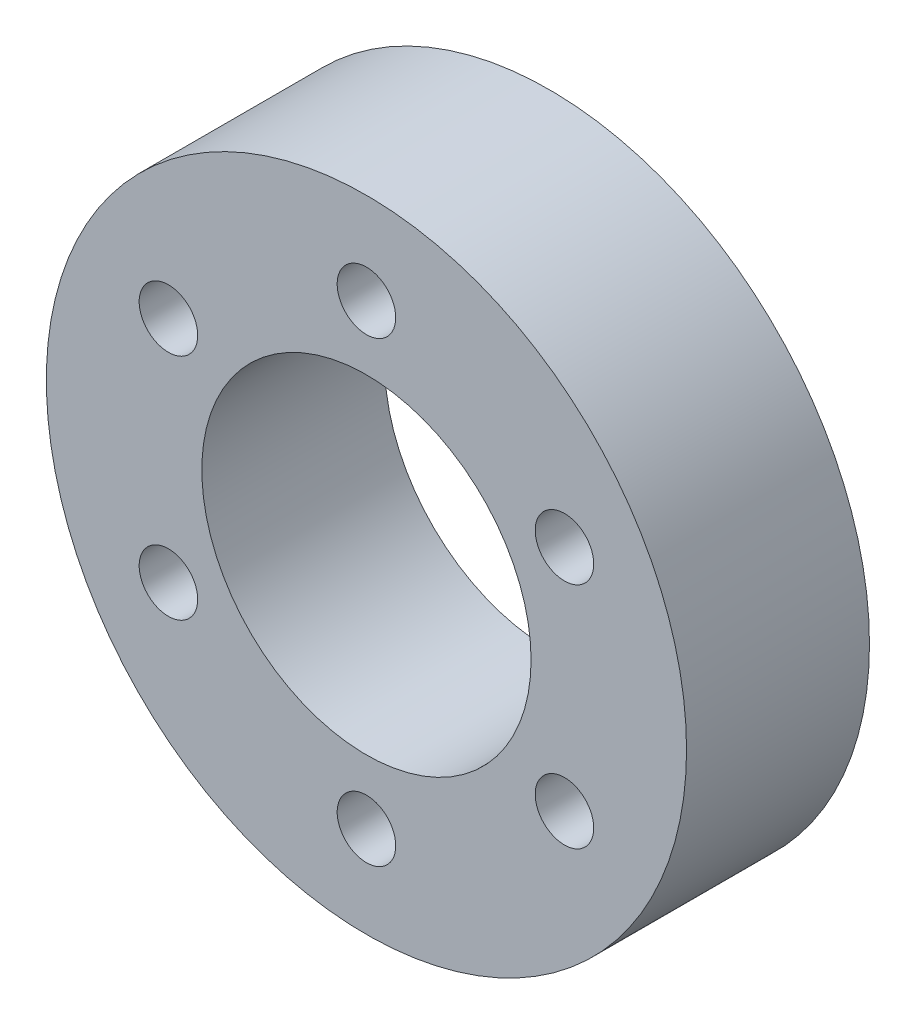
ISO-10303-21;
HEADER;
FILE_DESCRIPTION(('STEP AP214'),'2;1');
FILE_NAME('part.step','',(''),(''),'','','');
FILE_SCHEMA(('AUTOMOTIVE_DESIGN { 1 0 10303 214 1 1 1 1 }'));
ENDSEC;
DATA;
#1=APPLICATION_CONTEXT('core data for automotive mechanical design processes');
#2=APPLICATION_PROTOCOL_DEFINITION('international standard','automotive_design',2000,#1);
#3=PRODUCT_CONTEXT('',#1,'mechanical');
#4=PRODUCT('Part','Part','',(#3));
#5=PRODUCT_RELATED_PRODUCT_CATEGORY('part','',(#4));
#6=PRODUCT_DEFINITION_FORMATION('','',#4);
#7=PRODUCT_DEFINITION_CONTEXT('part definition',#1,'design');
#8=PRODUCT_DEFINITION('design','',#6,#7);
#9=PRODUCT_DEFINITION_SHAPE('','',#8);
#10=(LENGTH_UNIT() NAMED_UNIT(*) SI_UNIT(.MILLI.,.METRE.));
#11=(NAMED_UNIT(*) PLANE_ANGLE_UNIT() SI_UNIT($,.RADIAN.));
#12=(NAMED_UNIT(*) SI_UNIT($,.STERADIAN.) SOLID_ANGLE_UNIT());
#13=UNCERTAINTY_MEASURE_WITH_UNIT(LENGTH_MEASURE(1.E-05),#10,'distance_accuracy_value','');
#14=(GEOMETRIC_REPRESENTATION_CONTEXT(3) GLOBAL_UNCERTAINTY_ASSIGNED_CONTEXT((#13)) GLOBAL_UNIT_ASSIGNED_CONTEXT((#10,
#11,#12)) REPRESENTATION_CONTEXT('',''));
#15=CARTESIAN_POINT('',(0.,0.,0.));
#16=DIRECTION('',(0.,0.,1.));
#17=DIRECTION('',(1.,0.,0.));
#18=AXIS2_PLACEMENT_3D('',#15,#16,#17);
#19=CARTESIAN_POINT('',(0.,0.,10.));
#20=DIRECTION('',(0.,0.,1.));
#21=DIRECTION('',(1.,0.,0.));
#22=AXIS2_PLACEMENT_3D('',#19,#20,#21);
#23=PLANE('',#22);
#24=CARTESIAN_POINT('',(-10.8253175473055,6.24999999999999,10.));
#25=DIRECTION('',(0.,0.,1.));
#26=DIRECTION('',(1.,0.,0.));
#27=AXIS2_PLACEMENT_3D('',#24,#25,#26);
#28=CIRCLE('',#27,1.6);
#29=CARTESIAN_POINT('',(-9.22531754730549,6.24999999999999,10.));
#30=VERTEX_POINT('',#29);
#31=EDGE_CURVE('E71',#30,#30,#28,.T.);
#32=ORIENTED_EDGE('',*,*,#31,.F.);
#33=EDGE_LOOP('',(#32));
#34=FACE_BOUND('',#33,.T.);
#35=CARTESIAN_POINT('',(0.,-12.5,10.));
#36=DIRECTION('',(0.,0.,1.));
#37=DIRECTION('',(1.,0.,0.));
#38=AXIS2_PLACEMENT_3D('',#35,#36,#37);
#39=CIRCLE('',#38,1.6);
#40=CARTESIAN_POINT('',(1.6,-12.5,10.));
#41=VERTEX_POINT('',#40);
#42=EDGE_CURVE('E59',#41,#41,#39,.T.);
#43=ORIENTED_EDGE('',*,*,#42,.F.);
#44=EDGE_LOOP('',(#43));
#45=FACE_BOUND('',#44,.T.);
#46=CARTESIAN_POINT('',(10.8253175473055,6.25000000000001,10.));
#47=DIRECTION('',(0.,0.,1.));
#48=DIRECTION('',(1.,0.,0.));
#49=AXIS2_PLACEMENT_3D('',#46,#47,#48);
#50=CIRCLE('',#49,1.6);
#51=CARTESIAN_POINT('',(12.4253175473055,6.25000000000001,10.));
#52=VERTEX_POINT('',#51);
#53=EDGE_CURVE('E47',#52,#52,#50,.T.);
#54=ORIENTED_EDGE('',*,*,#53,.F.);
#55=EDGE_LOOP('',(#54));
#56=FACE_BOUND('',#55,.T.);
#57=CARTESIAN_POINT('',(0.,0.,10.));
#58=DIRECTION('',(0.,0.,1.));
#59=DIRECTION('',(1.,0.,0.));
#60=AXIS2_PLACEMENT_3D('',#57,#58,#59);
#61=CIRCLE('',#60,17.5);
#62=CARTESIAN_POINT('',(17.5,0.,10.));
#63=VERTEX_POINT('',#62);
#64=EDGE_CURVE('E10',#63,#63,#61,.T.);
#65=ORIENTED_EDGE('',*,*,#64,.T.);
#66=EDGE_LOOP('',(#65));
#67=FACE_BOUND('',#66,.T.);
#68=CARTESIAN_POINT('',(0.,12.5,10.));
#69=DIRECTION('',(0.,0.,1.));
#70=DIRECTION('',(1.,0.,0.));
#71=AXIS2_PLACEMENT_3D('',#68,#69,#70);
#72=CIRCLE('',#71,1.6);
#73=CARTESIAN_POINT('',(1.6,12.5,10.));
#74=VERTEX_POINT('',#73);
#75=EDGE_CURVE('E42',#74,#74,#72,.T.);
#76=ORIENTED_EDGE('',*,*,#75,.F.);
#77=EDGE_LOOP('',(#76));
#78=FACE_BOUND('',#77,.T.);
#79=CARTESIAN_POINT('',(10.8253175473055,-6.25,10.));
#80=DIRECTION('',(0.,0.,1.));
#81=DIRECTION('',(1.,0.,0.));
#82=AXIS2_PLACEMENT_3D('',#79,#80,#81);
#83=CIRCLE('',#82,1.6);
#84=CARTESIAN_POINT('',(12.4253175473055,-6.25,10.));
#85=VERTEX_POINT('',#84);
#86=EDGE_CURVE('E53',#85,#85,#83,.T.);
#87=ORIENTED_EDGE('',*,*,#86,.F.);
#88=EDGE_LOOP('',(#87));
#89=FACE_BOUND('',#88,.T.);
#90=CARTESIAN_POINT('',(-10.8253175473055,-6.25000000000001,10.));
#91=DIRECTION('',(0.,0.,1.));
#92=DIRECTION('',(1.,0.,0.));
#93=AXIS2_PLACEMENT_3D('',#90,#91,#92);
#94=CIRCLE('',#93,1.6);
#95=CARTESIAN_POINT('',(-9.22531754730549,-6.25000000000001,10.));
#96=VERTEX_POINT('',#95);
#97=EDGE_CURVE('E65',#96,#96,#94,.T.);
#98=ORIENTED_EDGE('',*,*,#97,.F.);
#99=EDGE_LOOP('',(#98));
#100=FACE_BOUND('',#99,.T.);
#101=CARTESIAN_POINT('',(0.,0.,10.));
#102=DIRECTION('',(0.,0.,1.));
#103=DIRECTION('',(1.,0.,0.));
#104=AXIS2_PLACEMENT_3D('',#101,#102,#103);
#105=CIRCLE('',#104,9.);
#106=CARTESIAN_POINT('',(9.,0.,10.));
#107=VERTEX_POINT('',#106);
#108=EDGE_CURVE('E77',#107,#107,#105,.T.);
#109=ORIENTED_EDGE('',*,*,#108,.F.);
#110=EDGE_LOOP('',(#109));
#111=FACE_BOUND('',#110,.T.);
#112=ADVANCED_FACE('F31',(#34,#45,#56,#67,#78,#89,#100,#111),#23,.T.);
#113=CARTESIAN_POINT('',(0.,0.,0.));
#114=DIRECTION('',(0.,0.,1.));
#115=DIRECTION('',(1.,0.,0.));
#116=AXIS2_PLACEMENT_3D('',#113,#114,#115);
#117=PLANE('',#116);
#118=CARTESIAN_POINT('',(0.,0.,0.));
#119=DIRECTION('',(0.,0.,1.));
#120=DIRECTION('',(1.,0.,0.));
#121=AXIS2_PLACEMENT_3D('',#118,#119,#120);
#122=CIRCLE('',#121,17.5);
#123=CARTESIAN_POINT('',(17.5,0.,0.));
#124=VERTEX_POINT('',#123);
#125=EDGE_CURVE('E35',#124,#124,#122,.T.);
#126=ORIENTED_EDGE('',*,*,#125,.F.);
#127=EDGE_LOOP('',(#126));
#128=FACE_BOUND('',#127,.T.);
#129=CARTESIAN_POINT('',(0.,12.5,0.));
#130=DIRECTION('',(0.,0.,1.));
#131=DIRECTION('',(1.,0.,0.));
#132=AXIS2_PLACEMENT_3D('',#129,#130,#131);
#133=CIRCLE('',#132,1.6);
#134=CARTESIAN_POINT('',(1.6,12.5,0.));
#135=VERTEX_POINT('',#134);
#136=EDGE_CURVE('E44',#135,#135,#133,.T.);
#137=ORIENTED_EDGE('',*,*,#136,.T.);
#138=EDGE_LOOP('',(#137));
#139=FACE_BOUND('',#138,.T.);
#140=CARTESIAN_POINT('',(10.8253175473055,6.25000000000001,0.));
#141=DIRECTION('',(0.,0.,1.));
#142=DIRECTION('',(1.,0.,0.));
#143=AXIS2_PLACEMENT_3D('',#140,#141,#142);
#144=CIRCLE('',#143,1.6);
#145=CARTESIAN_POINT('',(12.4253175473055,6.25000000000001,0.));
#146=VERTEX_POINT('',#145);
#147=EDGE_CURVE('E50',#146,#146,#144,.T.);
#148=ORIENTED_EDGE('',*,*,#147,.T.);
#149=EDGE_LOOP('',(#148));
#150=FACE_BOUND('',#149,.T.);
#151=CARTESIAN_POINT('',(10.8253175473055,-6.25,0.));
#152=DIRECTION('',(0.,0.,1.));
#153=DIRECTION('',(1.,0.,0.));
#154=AXIS2_PLACEMENT_3D('',#151,#152,#153);
#155=CIRCLE('',#154,1.6);
#156=CARTESIAN_POINT('',(12.4253175473055,-6.25,0.));
#157=VERTEX_POINT('',#156);
#158=EDGE_CURVE('E56',#157,#157,#155,.T.);
#159=ORIENTED_EDGE('',*,*,#158,.T.);
#160=EDGE_LOOP('',(#159));
#161=FACE_BOUND('',#160,.T.);
#162=CARTESIAN_POINT('',(0.,-12.5,0.));
#163=DIRECTION('',(0.,0.,1.));
#164=DIRECTION('',(1.,0.,0.));
#165=AXIS2_PLACEMENT_3D('',#162,#163,#164);
#166=CIRCLE('',#165,1.6);
#167=CARTESIAN_POINT('',(1.6,-12.5,0.));
#168=VERTEX_POINT('',#167);
#169=EDGE_CURVE('E62',#168,#168,#166,.T.);
#170=ORIENTED_EDGE('',*,*,#169,.T.);
#171=EDGE_LOOP('',(#170));
#172=FACE_BOUND('',#171,.T.);
#173=CARTESIAN_POINT('',(-10.8253175473055,-6.25000000000001,0.));
#174=DIRECTION('',(0.,0.,1.));
#175=DIRECTION('',(1.,0.,0.));
#176=AXIS2_PLACEMENT_3D('',#173,#174,#175);
#177=CIRCLE('',#176,1.6);
#178=CARTESIAN_POINT('',(-9.22531754730549,-6.25000000000001,0.));
#179=VERTEX_POINT('',#178);
#180=EDGE_CURVE('E68',#179,#179,#177,.T.);
#181=ORIENTED_EDGE('',*,*,#180,.T.);
#182=EDGE_LOOP('',(#181));
#183=FACE_BOUND('',#182,.T.);
#184=CARTESIAN_POINT('',(-10.8253175473055,6.24999999999999,0.));
#185=DIRECTION('',(0.,0.,1.));
#186=DIRECTION('',(1.,0.,0.));
#187=AXIS2_PLACEMENT_3D('',#184,#185,#186);
#188=CIRCLE('',#187,1.6);
#189=CARTESIAN_POINT('',(-9.22531754730549,6.24999999999999,0.));
#190=VERTEX_POINT('',#189);
#191=EDGE_CURVE('E74',#190,#190,#188,.T.);
#192=ORIENTED_EDGE('',*,*,#191,.T.);
#193=EDGE_LOOP('',(#192));
#194=FACE_BOUND('',#193,.T.);
#195=CARTESIAN_POINT('',(0.,0.,0.));
#196=DIRECTION('',(0.,0.,1.));
#197=DIRECTION('',(1.,0.,0.));
#198=AXIS2_PLACEMENT_3D('',#195,#196,#197);
#199=CIRCLE('',#198,9.);
#200=CARTESIAN_POINT('',(9.,0.,0.));
#201=VERTEX_POINT('',#200);
#202=EDGE_CURVE('E80',#201,#201,#199,.T.);
#203=ORIENTED_EDGE('',*,*,#202,.T.);
#204=EDGE_LOOP('',(#203));
#205=FACE_BOUND('',#204,.T.);
#206=ADVANCED_FACE('F90',(#128,#139,#150,#161,#172,#183,#194,#205),#117,.F.);
#207=CARTESIAN_POINT('',(0.,0.,10.));
#208=DIRECTION('',(0.,0.,-1.));
#209=DIRECTION('',(-1.,0.,0.));
#210=AXIS2_PLACEMENT_3D('',#207,#208,#209);
#211=CYLINDRICAL_SURFACE('',#210,17.5);
#212=ORIENTED_EDGE('',*,*,#64,.F.);
#213=EDGE_LOOP('',(#212));
#214=FACE_BOUND('',#213,.T.);
#215=ORIENTED_EDGE('',*,*,#125,.T.);
#216=EDGE_LOOP('',(#215));
#217=FACE_BOUND('',#216,.T.);
#218=ADVANCED_FACE('F33',(#214,#217),#211,.T.);
#219=CARTESIAN_POINT('',(0.,12.5,10.));
#220=DIRECTION('',(0.,0.,-1.));
#221=DIRECTION('',(-1.,0.,0.));
#222=AXIS2_PLACEMENT_3D('',#219,#220,#221);
#223=CYLINDRICAL_SURFACE('',#222,1.6);
#224=ORIENTED_EDGE('',*,*,#75,.T.);
#225=EDGE_LOOP('',(#224));
#226=FACE_BOUND('',#225,.T.);
#227=ORIENTED_EDGE('',*,*,#136,.F.);
#228=EDGE_LOOP('',(#227));
#229=FACE_BOUND('',#228,.T.);
#230=ADVANCED_FACE('F100',(#226,#229),#223,.F.);
#231=CARTESIAN_POINT('',(10.8253175473055,6.25000000000001,10.));
#232=DIRECTION('',(0.,0.,-1.));
#233=DIRECTION('',(-1.,0.,0.));
#234=AXIS2_PLACEMENT_3D('',#231,#232,#233);
#235=CYLINDRICAL_SURFACE('',#234,1.6);
#236=ORIENTED_EDGE('',*,*,#53,.T.);
#237=EDGE_LOOP('',(#236));
#238=FACE_BOUND('',#237,.T.);
#239=ORIENTED_EDGE('',*,*,#147,.F.);
#240=EDGE_LOOP('',(#239));
#241=FACE_BOUND('',#240,.T.);
#242=ADVANCED_FACE('F103',(#238,#241),#235,.F.);
#243=CARTESIAN_POINT('',(10.8253175473055,-6.25,10.));
#244=DIRECTION('',(0.,0.,-1.));
#245=DIRECTION('',(-1.,0.,0.));
#246=AXIS2_PLACEMENT_3D('',#243,#244,#245);
#247=CYLINDRICAL_SURFACE('',#246,1.6);
#248=ORIENTED_EDGE('',*,*,#86,.T.);
#249=EDGE_LOOP('',(#248));
#250=FACE_BOUND('',#249,.T.);
#251=ORIENTED_EDGE('',*,*,#158,.F.);
#252=EDGE_LOOP('',(#251));
#253=FACE_BOUND('',#252,.T.);
#254=ADVANCED_FACE('F107',(#250,#253),#247,.F.);
#255=CARTESIAN_POINT('',(0.,-12.5,10.));
#256=DIRECTION('',(0.,0.,-1.));
#257=DIRECTION('',(-1.,0.,0.));
#258=AXIS2_PLACEMENT_3D('',#255,#256,#257);
#259=CYLINDRICAL_SURFACE('',#258,1.6);
#260=ORIENTED_EDGE('',*,*,#42,.T.);
#261=EDGE_LOOP('',(#260));
#262=FACE_BOUND('',#261,.T.);
#263=ORIENTED_EDGE('',*,*,#169,.F.);
#264=EDGE_LOOP('',(#263));
#265=FACE_BOUND('',#264,.T.);
#266=ADVANCED_FACE('F111',(#262,#265),#259,.F.);
#267=CARTESIAN_POINT('',(-10.8253175473055,-6.25000000000001,10.));
#268=DIRECTION('',(0.,0.,-1.));
#269=DIRECTION('',(-1.,0.,0.));
#270=AXIS2_PLACEMENT_3D('',#267,#268,#269);
#271=CYLINDRICAL_SURFACE('',#270,1.6);
#272=ORIENTED_EDGE('',*,*,#97,.T.);
#273=EDGE_LOOP('',(#272));
#274=FACE_BOUND('',#273,.T.);
#275=ORIENTED_EDGE('',*,*,#180,.F.);
#276=EDGE_LOOP('',(#275));
#277=FACE_BOUND('',#276,.T.);
#278=ADVANCED_FACE('F115',(#274,#277),#271,.F.);
#279=CARTESIAN_POINT('',(-10.8253175473055,6.24999999999999,10.));
#280=DIRECTION('',(0.,0.,-1.));
#281=DIRECTION('',(-1.,0.,0.));
#282=AXIS2_PLACEMENT_3D('',#279,#280,#281);
#283=CYLINDRICAL_SURFACE('',#282,1.6);
#284=ORIENTED_EDGE('',*,*,#31,.T.);
#285=EDGE_LOOP('',(#284));
#286=FACE_BOUND('',#285,.T.);
#287=ORIENTED_EDGE('',*,*,#191,.F.);
#288=EDGE_LOOP('',(#287));
#289=FACE_BOUND('',#288,.T.);
#290=ADVANCED_FACE('F119',(#286,#289),#283,.F.);
#291=CARTESIAN_POINT('',(0.,0.,10.));
#292=DIRECTION('',(0.,0.,-1.));
#293=DIRECTION('',(-1.,0.,0.));
#294=AXIS2_PLACEMENT_3D('',#291,#292,#293);
#295=CYLINDRICAL_SURFACE('',#294,9.);
#296=ORIENTED_EDGE('',*,*,#108,.T.);
#297=EDGE_LOOP('',(#296));
#298=FACE_BOUND('',#297,.T.);
#299=ORIENTED_EDGE('',*,*,#202,.F.);
#300=EDGE_LOOP('',(#299));
#301=FACE_BOUND('',#300,.T.);
#302=ADVANCED_FACE('F86',(#298,#301),#295,.F.);
#303=CLOSED_SHELL('',(#112,#206,#218,#230,#242,#254,#266,#278,#290,#302));
#304=MANIFOLD_SOLID_BREP('B2',#303);
#305=ADVANCED_BREP_SHAPE_REPRESENTATION('',(#18,#304),#14);
#306=SHAPE_DEFINITION_REPRESENTATION(#9,#305);
ENDSEC;
END-ISO-10303-21;
